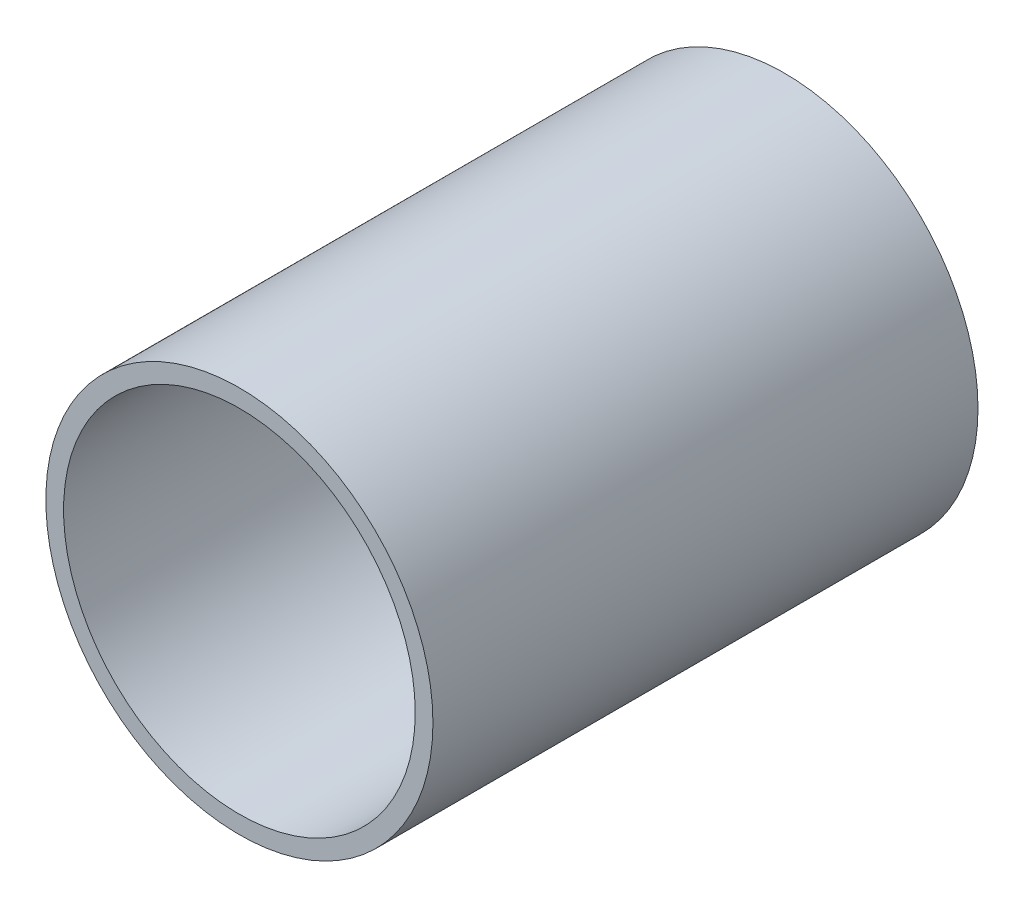
ISO-10303-21;
HEADER;
FILE_DESCRIPTION(('STEP AP214'),'2;1');
FILE_NAME('part.step','',(''),(''),'','','');
FILE_SCHEMA(('AUTOMOTIVE_DESIGN { 1 0 10303 214 1 1 1 1 }'));
ENDSEC;
DATA;
#1=APPLICATION_CONTEXT('core data for automotive mechanical design processes');
#2=APPLICATION_PROTOCOL_DEFINITION('international standard','automotive_design',2000,#1);
#3=PRODUCT_CONTEXT('',#1,'mechanical');
#4=PRODUCT('Part','Part','',(#3));
#5=PRODUCT_RELATED_PRODUCT_CATEGORY('part','',(#4));
#6=PRODUCT_DEFINITION_FORMATION('','',#4);
#7=PRODUCT_DEFINITION_CONTEXT('part definition',#1,'design');
#8=PRODUCT_DEFINITION('design','',#6,#7);
#9=PRODUCT_DEFINITION_SHAPE('','',#8);
#10=(LENGTH_UNIT() NAMED_UNIT(*) SI_UNIT(.MILLI.,.METRE.));
#11=(NAMED_UNIT(*) PLANE_ANGLE_UNIT() SI_UNIT($,.RADIAN.));
#12=(NAMED_UNIT(*) SI_UNIT($,.STERADIAN.) SOLID_ANGLE_UNIT());
#13=UNCERTAINTY_MEASURE_WITH_UNIT(LENGTH_MEASURE(1.E-05),#10,'distance_accuracy_value','');
#14=(GEOMETRIC_REPRESENTATION_CONTEXT(3) GLOBAL_UNCERTAINTY_ASSIGNED_CONTEXT((#13)) GLOBAL_UNIT_ASSIGNED_CONTEXT((#10,
#11,#12)) REPRESENTATION_CONTEXT('',''));
#15=CARTESIAN_POINT('',(0.,0.,0.));
#16=DIRECTION('',(0.,0.,1.));
#17=DIRECTION('',(1.,0.,0.));
#18=AXIS2_PLACEMENT_3D('',#15,#16,#17);
#19=CARTESIAN_POINT('',(0.,0.,0.));
#20=DIRECTION('',(0.,0.,1.));
#21=DIRECTION('',(1.,0.,0.));
#22=AXIS2_PLACEMENT_3D('',#19,#20,#21);
#23=CYLINDRICAL_SURFACE('',#22,15.875);
#24=CARTESIAN_POINT('',(0.,0.,24.60625));
#25=DIRECTION('',(0.,0.,1.));
#26=DIRECTION('',(1.,0.,0.));
#27=AXIS2_PLACEMENT_3D('',#24,#25,#26);
#28=CIRCLE('',#27,15.875);
#29=CARTESIAN_POINT('',(15.875,0.,24.60625));
#30=VERTEX_POINT('',#29);
#31=EDGE_CURVE('E26',#30,#30,#28,.F.);
#32=ORIENTED_EDGE('',*,*,#31,.F.);
#33=EDGE_LOOP('',(#32));
#34=FACE_BOUND('',#33,.T.);
#35=CARTESIAN_POINT('',(0.,0.,-24.60625));
#36=DIRECTION('',(0.,0.,1.));
#37=DIRECTION('',(1.,0.,0.));
#38=AXIS2_PLACEMENT_3D('',#35,#36,#37);
#39=CIRCLE('',#38,15.875);
#40=CARTESIAN_POINT('',(15.875,0.,-24.60625));
#41=VERTEX_POINT('',#40);
#42=EDGE_CURVE('E17',#41,#41,#39,.F.);
#43=ORIENTED_EDGE('',*,*,#42,.T.);
#44=EDGE_LOOP('',(#43));
#45=FACE_BOUND('',#44,.T.);
#46=ADVANCED_FACE('F14',(#34,#45),#23,.F.);
#47=CARTESIAN_POINT('',(0.,0.,-24.60625));
#48=DIRECTION('',(0.,0.,1.));
#49=DIRECTION('',(1.,0.,0.));
#50=AXIS2_PLACEMENT_3D('',#47,#48,#49);
#51=PLANE('',#50);
#52=ORIENTED_EDGE('',*,*,#42,.F.);
#53=EDGE_LOOP('',(#52));
#54=FACE_BOUND('',#53,.T.);
#55=CARTESIAN_POINT('',(0.,0.,-24.60625));
#56=DIRECTION('',(0.,0.,1.));
#57=DIRECTION('',(1.,0.,0.));
#58=AXIS2_PLACEMENT_3D('',#55,#56,#57);
#59=CIRCLE('',#58,17.4752);
#60=CARTESIAN_POINT('',(17.4752,0.,-24.60625));
#61=VERTEX_POINT('',#60);
#62=EDGE_CURVE('E21',#61,#61,#59,.T.);
#63=ORIENTED_EDGE('',*,*,#62,.F.);
#64=EDGE_LOOP('',(#63));
#65=FACE_BOUND('',#64,.T.);
#66=ADVANCED_FACE('F35',(#54,#65),#51,.F.);
#67=CARTESIAN_POINT('',(0.,0.,24.60625));
#68=DIRECTION('',(0.,0.,1.));
#69=DIRECTION('',(1.,0.,0.));
#70=AXIS2_PLACEMENT_3D('',#67,#68,#69);
#71=PLANE('',#70);
#72=ORIENTED_EDGE('',*,*,#31,.T.);
#73=EDGE_LOOP('',(#72));
#74=FACE_BOUND('',#73,.T.);
#75=CARTESIAN_POINT('',(0.,0.,24.60625));
#76=DIRECTION('',(0.,0.,1.));
#77=DIRECTION('',(1.,0.,0.));
#78=AXIS2_PLACEMENT_3D('',#75,#76,#77);
#79=CIRCLE('',#78,17.4752);
#80=CARTESIAN_POINT('',(17.4752,0.,24.60625));
#81=VERTEX_POINT('',#80);
#82=EDGE_CURVE('E10',#81,#81,#79,.F.);
#83=ORIENTED_EDGE('',*,*,#82,.F.);
#84=EDGE_LOOP('',(#83));
#85=FACE_BOUND('',#84,.T.);
#86=ADVANCED_FACE('F38',(#74,#85),#71,.T.);
#87=CARTESIAN_POINT('',(0.,0.,0.));
#88=DIRECTION('',(0.,0.,1.));
#89=DIRECTION('',(1.,0.,0.));
#90=AXIS2_PLACEMENT_3D('',#87,#88,#89);
#91=CYLINDRICAL_SURFACE('',#90,17.4752);
#92=ORIENTED_EDGE('',*,*,#82,.T.);
#93=EDGE_LOOP('',(#92));
#94=FACE_BOUND('',#93,.T.);
#95=ORIENTED_EDGE('',*,*,#62,.T.);
#96=EDGE_LOOP('',(#95));
#97=FACE_BOUND('',#96,.T.);
#98=ADVANCED_FACE('F41',(#94,#97),#91,.T.);
#99=CLOSED_SHELL('',(#46,#66,#86,#98));
#100=MANIFOLD_SOLID_BREP('B1',#99);
#101=ADVANCED_BREP_SHAPE_REPRESENTATION('',(#18,#100),#14);
#102=SHAPE_DEFINITION_REPRESENTATION(#9,#101);
ENDSEC;
END-ISO-10303-21;
